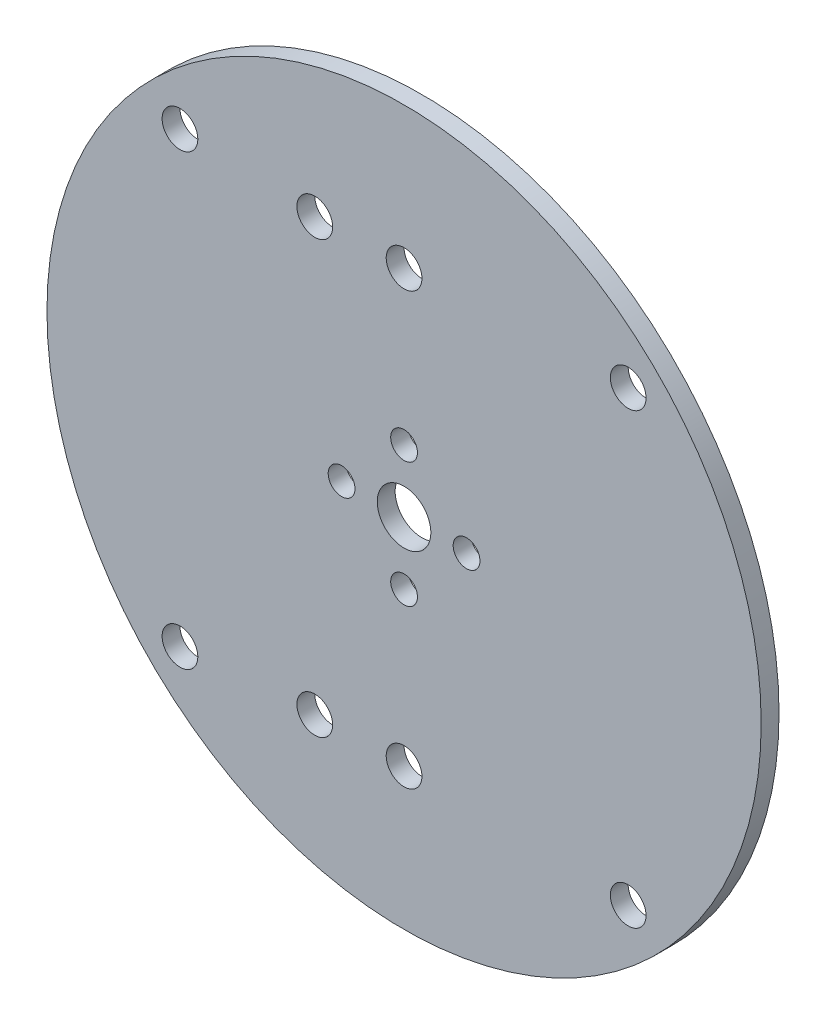
ISO-10303-21;
HEADER;
FILE_DESCRIPTION(('STEP AP214'),'2;1');
FILE_NAME('part.step','',(''),(''),'','','');
FILE_SCHEMA(('AUTOMOTIVE_DESIGN { 1 0 10303 214 1 1 1 1 }'));
ENDSEC;
DATA;
#1=APPLICATION_CONTEXT('core data for automotive mechanical design processes');
#2=APPLICATION_PROTOCOL_DEFINITION('international standard','automotive_design',2000,#1);
#3=PRODUCT_CONTEXT('',#1,'mechanical');
#4=PRODUCT('Part','Part','',(#3));
#5=PRODUCT_RELATED_PRODUCT_CATEGORY('part','',(#4));
#6=PRODUCT_DEFINITION_FORMATION('','',#4);
#7=PRODUCT_DEFINITION_CONTEXT('part definition',#1,'design');
#8=PRODUCT_DEFINITION('design','',#6,#7);
#9=PRODUCT_DEFINITION_SHAPE('','',#8);
#10=(LENGTH_UNIT() NAMED_UNIT(*) SI_UNIT(.MILLI.,.METRE.));
#11=(NAMED_UNIT(*) PLANE_ANGLE_UNIT() SI_UNIT($,.RADIAN.));
#12=(NAMED_UNIT(*) SI_UNIT($,.STERADIAN.) SOLID_ANGLE_UNIT());
#13=UNCERTAINTY_MEASURE_WITH_UNIT(LENGTH_MEASURE(1.E-05),#10,'distance_accuracy_value','');
#14=(GEOMETRIC_REPRESENTATION_CONTEXT(3) GLOBAL_UNCERTAINTY_ASSIGNED_CONTEXT((#13)) GLOBAL_UNIT_ASSIGNED_CONTEXT((#10,
#11,#12)) REPRESENTATION_CONTEXT('',''));
#15=CARTESIAN_POINT('',(0.,0.,0.));
#16=DIRECTION('',(0.,0.,1.));
#17=DIRECTION('',(1.,0.,0.));
#18=AXIS2_PLACEMENT_3D('',#15,#16,#17);
#19=CARTESIAN_POINT('',(64.7426065483763,40.5692941488828,2.));
#20=DIRECTION('',(0.,0.,1.));
#21=DIRECTION('',(1.,0.,0.));
#22=AXIS2_PLACEMENT_3D('',#19,#20,#21);
#23=PLANE('',#22);
#24=CARTESIAN_POINT('',(64.7426065483763,40.5692941488828,2.));
#25=DIRECTION('',(0.,0.,1.));
#26=DIRECTION('',(1.,0.,0.));
#27=AXIS2_PLACEMENT_3D('',#24,#25,#26);
#28=CIRCLE('',#27,3.00000000000001);
#29=CARTESIAN_POINT('',(67.7426065483763,40.5692941488828,2.));
#30=VERTEX_POINT('',#29);
#31=EDGE_CURVE('E109',#30,#30,#28,.T.);
#32=ORIENTED_EDGE('',*,*,#31,.F.);
#33=EDGE_LOOP('',(#32));
#34=FACE_BOUND('',#33,.T.);
#35=CARTESIAN_POINT('',(71.7426065483763,40.5692941488828,2.));
#36=DIRECTION('',(0.,0.,1.));
#37=DIRECTION('',(1.,0.,0.));
#38=AXIS2_PLACEMENT_3D('',#35,#36,#37);
#39=CIRCLE('',#38,1.49999999999994);
#40=CARTESIAN_POINT('',(73.2426065483762,40.5692941488828,2.));
#41=VERTEX_POINT('',#40);
#42=EDGE_CURVE('E97',#41,#41,#39,.T.);
#43=ORIENTED_EDGE('',*,*,#42,.F.);
#44=EDGE_LOOP('',(#43));
#45=FACE_BOUND('',#44,.T.);
#46=CARTESIAN_POINT('',(57.7426065483763,40.5692941488828,2.));
#47=DIRECTION('',(0.,0.,1.));
#48=DIRECTION('',(1.,0.,0.));
#49=AXIS2_PLACEMENT_3D('',#46,#47,#48);
#50=CIRCLE('',#49,1.49999999999995);
#51=CARTESIAN_POINT('',(59.2426065483762,40.5692941488828,2.));
#52=VERTEX_POINT('',#51);
#53=EDGE_CURVE('E85',#52,#52,#50,.T.);
#54=ORIENTED_EDGE('',*,*,#53,.F.);
#55=EDGE_LOOP('',(#54));
#56=FACE_BOUND('',#55,.T.);
#57=CARTESIAN_POINT('',(89.8448972804962,15.4670034167628,2.));
#58=DIRECTION('',(0.,0.,1.));
#59=DIRECTION('',(1.,0.,0.));
#60=AXIS2_PLACEMENT_3D('',#57,#58,#59);
#61=CIRCLE('',#60,2.);
#62=CARTESIAN_POINT('',(91.8448972804962,15.4670034167628,2.));
#63=VERTEX_POINT('',#62);
#64=EDGE_CURVE('E73',#63,#63,#61,.T.);
#65=ORIENTED_EDGE('',*,*,#64,.F.);
#66=EDGE_LOOP('',(#65));
#67=FACE_BOUND('',#66,.T.);
#68=CARTESIAN_POINT('',(54.7426065483771,64.7142941488828,2.));
#69=DIRECTION('',(0.,0.,1.));
#70=DIRECTION('',(1.,0.,0.));
#71=AXIS2_PLACEMENT_3D('',#68,#69,#70);
#72=CIRCLE('',#71,2.);
#73=CARTESIAN_POINT('',(56.7426065483772,64.7142941488828,2.));
#74=VERTEX_POINT('',#73);
#75=EDGE_CURVE('E61',#74,#74,#72,.T.);
#76=ORIENTED_EDGE('',*,*,#75,.F.);
#77=EDGE_LOOP('',(#76));
#78=FACE_BOUND('',#77,.T.);
#79=CARTESIAN_POINT('',(39.6403158162562,15.4670034167628,2.));
#80=DIRECTION('',(0.,0.,1.));
#81=DIRECTION('',(1.,0.,0.));
#82=AXIS2_PLACEMENT_3D('',#79,#80,#81);
#83=CIRCLE('',#82,2.);
#84=CARTESIAN_POINT('',(41.6403158162562,15.4670034167628,2.));
#85=VERTEX_POINT('',#84);
#86=EDGE_CURVE('E49',#85,#85,#83,.T.);
#87=ORIENTED_EDGE('',*,*,#86,.F.);
#88=EDGE_LOOP('',(#87));
#89=FACE_BOUND('',#88,.T.);
#90=CARTESIAN_POINT('',(64.7426065483763,40.5692941488828,2.));
#91=DIRECTION('',(0.,0.,1.));
#92=DIRECTION('',(1.,0.,0.));
#93=AXIS2_PLACEMENT_3D('',#90,#91,#92);
#94=CIRCLE('',#93,40.);
#95=CARTESIAN_POINT('',(104.742606548376,40.5692941488828,2.));
#96=VERTEX_POINT('',#95);
#97=EDGE_CURVE('E10',#96,#96,#94,.T.);
#98=ORIENTED_EDGE('',*,*,#97,.T.);
#99=EDGE_LOOP('',(#98));
#100=FACE_BOUND('',#99,.T.);
#101=CARTESIAN_POINT('',(89.8448972804962,65.6715848810028,2.));
#102=DIRECTION('',(0.,0.,1.));
#103=DIRECTION('',(1.,0.,0.));
#104=AXIS2_PLACEMENT_3D('',#101,#102,#103);
#105=CIRCLE('',#104,2.);
#106=CARTESIAN_POINT('',(91.8448972804962,65.6715848810028,2.));
#107=VERTEX_POINT('',#106);
#108=EDGE_CURVE('E44',#107,#107,#105,.T.);
#109=ORIENTED_EDGE('',*,*,#108,.F.);
#110=EDGE_LOOP('',(#109));
#111=FACE_BOUND('',#110,.T.);
#112=CARTESIAN_POINT('',(39.6403158162562,65.6715848810028,2.));
#113=DIRECTION('',(0.,0.,1.));
#114=DIRECTION('',(1.,0.,0.));
#115=AXIS2_PLACEMENT_3D('',#112,#113,#114);
#116=CIRCLE('',#115,2.);
#117=CARTESIAN_POINT('',(41.6403158162562,65.6715848810028,2.));
#118=VERTEX_POINT('',#117);
#119=EDGE_CURVE('E55',#118,#118,#116,.T.);
#120=ORIENTED_EDGE('',*,*,#119,.F.);
#121=EDGE_LOOP('',(#120));
#122=FACE_BOUND('',#121,.T.);
#123=CARTESIAN_POINT('',(64.7426065483763,64.7142941488828,2.));
#124=DIRECTION('',(0.,0.,1.));
#125=DIRECTION('',(1.,0.,0.));
#126=AXIS2_PLACEMENT_3D('',#123,#124,#125);
#127=CIRCLE('',#126,2.);
#128=CARTESIAN_POINT('',(66.7426065483763,64.7142941488828,2.));
#129=VERTEX_POINT('',#128);
#130=EDGE_CURVE('E67',#129,#129,#127,.T.);
#131=ORIENTED_EDGE('',*,*,#130,.F.);
#132=EDGE_LOOP('',(#131));
#133=FACE_BOUND('',#132,.T.);
#134=CARTESIAN_POINT('',(64.7426065483763,16.4142941488828,2.));
#135=DIRECTION('',(0.,0.,1.));
#136=DIRECTION('',(1.,0.,0.));
#137=AXIS2_PLACEMENT_3D('',#134,#135,#136);
#138=CIRCLE('',#137,2.);
#139=CARTESIAN_POINT('',(66.7426065483763,16.4142941488828,2.));
#140=VERTEX_POINT('',#139);
#141=EDGE_CURVE('E79',#140,#140,#138,.T.);
#142=ORIENTED_EDGE('',*,*,#141,.F.);
#143=EDGE_LOOP('',(#142));
#144=FACE_BOUND('',#143,.T.);
#145=CARTESIAN_POINT('',(64.7426065483763,33.5692941488828,2.));
#146=DIRECTION('',(0.,0.,1.));
#147=DIRECTION('',(1.,0.,0.));
#148=AXIS2_PLACEMENT_3D('',#145,#146,#147);
#149=CIRCLE('',#148,1.49999999999994);
#150=CARTESIAN_POINT('',(66.2426065483762,33.5692941488828,2.));
#151=VERTEX_POINT('',#150);
#152=EDGE_CURVE('E91',#151,#151,#149,.T.);
#153=ORIENTED_EDGE('',*,*,#152,.F.);
#154=EDGE_LOOP('',(#153));
#155=FACE_BOUND('',#154,.T.);
#156=CARTESIAN_POINT('',(64.7426065483763,47.5692941488828,2.));
#157=DIRECTION('',(0.,0.,1.));
#158=DIRECTION('',(1.,0.,0.));
#159=AXIS2_PLACEMENT_3D('',#156,#157,#158);
#160=CIRCLE('',#159,1.49999999999994);
#161=CARTESIAN_POINT('',(66.2426065483762,47.5692941488828,2.));
#162=VERTEX_POINT('',#161);
#163=EDGE_CURVE('E103',#162,#162,#160,.T.);
#164=ORIENTED_EDGE('',*,*,#163,.F.);
#165=EDGE_LOOP('',(#164));
#166=FACE_BOUND('',#165,.T.);
#167=CARTESIAN_POINT('',(54.7426065483771,16.4142941488828,2.));
#168=DIRECTION('',(0.,0.,1.));
#169=DIRECTION('',(1.,0.,0.));
#170=AXIS2_PLACEMENT_3D('',#167,#168,#169);
#171=CIRCLE('',#170,2.);
#172=CARTESIAN_POINT('',(56.7426065483772,16.4142941488828,2.));
#173=VERTEX_POINT('',#172);
#174=EDGE_CURVE('E115',#173,#173,#171,.T.);
#175=ORIENTED_EDGE('',*,*,#174,.F.);
#176=EDGE_LOOP('',(#175));
#177=FACE_BOUND('',#176,.T.);
#178=ADVANCED_FACE('F33',(#34,#45,#56,#67,#78,#89,#100,#111,#122,#133,#144,#155,#166,#177),#23,.T.);
#179=CARTESIAN_POINT('',(64.7426065483763,40.5692941488828,0.));
#180=DIRECTION('',(0.,0.,1.));
#181=DIRECTION('',(1.,0.,0.));
#182=AXIS2_PLACEMENT_3D('',#179,#180,#181);
#183=PLANE('',#182);
#184=CARTESIAN_POINT('',(64.7426065483763,40.5692941488828,0.));
#185=DIRECTION('',(0.,0.,1.));
#186=DIRECTION('',(1.,0.,0.));
#187=AXIS2_PLACEMENT_3D('',#184,#185,#186);
#188=CIRCLE('',#187,3.00000000000001);
#189=CARTESIAN_POINT('',(67.7426065483763,40.5692941488828,0.));
#190=VERTEX_POINT('',#189);
#191=EDGE_CURVE('E112',#190,#190,#188,.T.);
#192=ORIENTED_EDGE('',*,*,#191,.T.);
#193=EDGE_LOOP('',(#192));
#194=FACE_BOUND('',#193,.T.);
#195=CARTESIAN_POINT('',(71.7426065483763,40.5692941488828,0.));
#196=DIRECTION('',(0.,0.,1.));
#197=DIRECTION('',(1.,0.,0.));
#198=AXIS2_PLACEMENT_3D('',#195,#196,#197);
#199=CIRCLE('',#198,1.49999999999994);
#200=CARTESIAN_POINT('',(73.2426065483762,40.5692941488828,0.));
#201=VERTEX_POINT('',#200);
#202=EDGE_CURVE('E100',#201,#201,#199,.T.);
#203=ORIENTED_EDGE('',*,*,#202,.T.);
#204=EDGE_LOOP('',(#203));
#205=FACE_BOUND('',#204,.T.);
#206=CARTESIAN_POINT('',(57.7426065483763,40.5692941488828,0.));
#207=DIRECTION('',(0.,0.,1.));
#208=DIRECTION('',(1.,0.,0.));
#209=AXIS2_PLACEMENT_3D('',#206,#207,#208);
#210=CIRCLE('',#209,1.49999999999995);
#211=CARTESIAN_POINT('',(59.2426065483762,40.5692941488828,0.));
#212=VERTEX_POINT('',#211);
#213=EDGE_CURVE('E88',#212,#212,#210,.T.);
#214=ORIENTED_EDGE('',*,*,#213,.T.);
#215=EDGE_LOOP('',(#214));
#216=FACE_BOUND('',#215,.T.);
#217=CARTESIAN_POINT('',(89.8448972804962,15.4670034167628,0.));
#218=DIRECTION('',(0.,0.,1.));
#219=DIRECTION('',(1.,0.,0.));
#220=AXIS2_PLACEMENT_3D('',#217,#218,#219);
#221=CIRCLE('',#220,2.);
#222=CARTESIAN_POINT('',(91.8448972804962,15.4670034167628,0.));
#223=VERTEX_POINT('',#222);
#224=EDGE_CURVE('E76',#223,#223,#221,.T.);
#225=ORIENTED_EDGE('',*,*,#224,.T.);
#226=EDGE_LOOP('',(#225));
#227=FACE_BOUND('',#226,.T.);
#228=CARTESIAN_POINT('',(54.7426065483771,64.7142941488828,0.));
#229=DIRECTION('',(0.,0.,1.));
#230=DIRECTION('',(1.,0.,0.));
#231=AXIS2_PLACEMENT_3D('',#228,#229,#230);
#232=CIRCLE('',#231,2.);
#233=CARTESIAN_POINT('',(56.7426065483772,64.7142941488828,0.));
#234=VERTEX_POINT('',#233);
#235=EDGE_CURVE('E64',#234,#234,#232,.T.);
#236=ORIENTED_EDGE('',*,*,#235,.T.);
#237=EDGE_LOOP('',(#236));
#238=FACE_BOUND('',#237,.T.);
#239=CARTESIAN_POINT('',(39.6403158162562,15.4670034167628,0.));
#240=DIRECTION('',(0.,0.,1.));
#241=DIRECTION('',(1.,0.,0.));
#242=AXIS2_PLACEMENT_3D('',#239,#240,#241);
#243=CIRCLE('',#242,2.);
#244=CARTESIAN_POINT('',(41.6403158162562,15.4670034167628,0.));
#245=VERTEX_POINT('',#244);
#246=EDGE_CURVE('E52',#245,#245,#243,.T.);
#247=ORIENTED_EDGE('',*,*,#246,.T.);
#248=EDGE_LOOP('',(#247));
#249=FACE_BOUND('',#248,.T.);
#250=CARTESIAN_POINT('',(64.7426065483763,40.5692941488828,0.));
#251=DIRECTION('',(0.,0.,1.));
#252=DIRECTION('',(1.,0.,0.));
#253=AXIS2_PLACEMENT_3D('',#250,#251,#252);
#254=CIRCLE('',#253,40.);
#255=CARTESIAN_POINT('',(104.742606548376,40.5692941488828,0.));
#256=VERTEX_POINT('',#255);
#257=EDGE_CURVE('E37',#256,#256,#254,.T.);
#258=ORIENTED_EDGE('',*,*,#257,.F.);
#259=EDGE_LOOP('',(#258));
#260=FACE_BOUND('',#259,.T.);
#261=CARTESIAN_POINT('',(89.8448972804962,65.6715848810028,0.));
#262=DIRECTION('',(0.,0.,1.));
#263=DIRECTION('',(1.,0.,0.));
#264=AXIS2_PLACEMENT_3D('',#261,#262,#263);
#265=CIRCLE('',#264,2.);
#266=CARTESIAN_POINT('',(91.8448972804962,65.6715848810028,0.));
#267=VERTEX_POINT('',#266);
#268=EDGE_CURVE('E46',#267,#267,#265,.T.);
#269=ORIENTED_EDGE('',*,*,#268,.T.);
#270=EDGE_LOOP('',(#269));
#271=FACE_BOUND('',#270,.T.);
#272=CARTESIAN_POINT('',(39.6403158162562,65.6715848810028,0.));
#273=DIRECTION('',(0.,0.,1.));
#274=DIRECTION('',(1.,0.,0.));
#275=AXIS2_PLACEMENT_3D('',#272,#273,#274);
#276=CIRCLE('',#275,2.);
#277=CARTESIAN_POINT('',(41.6403158162562,65.6715848810028,0.));
#278=VERTEX_POINT('',#277);
#279=EDGE_CURVE('E58',#278,#278,#276,.T.);
#280=ORIENTED_EDGE('',*,*,#279,.T.);
#281=EDGE_LOOP('',(#280));
#282=FACE_BOUND('',#281,.T.);
#283=CARTESIAN_POINT('',(64.7426065483763,64.7142941488828,0.));
#284=DIRECTION('',(0.,0.,1.));
#285=DIRECTION('',(1.,0.,0.));
#286=AXIS2_PLACEMENT_3D('',#283,#284,#285);
#287=CIRCLE('',#286,2.);
#288=CARTESIAN_POINT('',(66.7426065483763,64.7142941488828,0.));
#289=VERTEX_POINT('',#288);
#290=EDGE_CURVE('E70',#289,#289,#287,.T.);
#291=ORIENTED_EDGE('',*,*,#290,.T.);
#292=EDGE_LOOP('',(#291));
#293=FACE_BOUND('',#292,.T.);
#294=CARTESIAN_POINT('',(64.7426065483763,16.4142941488828,0.));
#295=DIRECTION('',(0.,0.,1.));
#296=DIRECTION('',(1.,0.,0.));
#297=AXIS2_PLACEMENT_3D('',#294,#295,#296);
#298=CIRCLE('',#297,2.);
#299=CARTESIAN_POINT('',(66.7426065483763,16.4142941488828,0.));
#300=VERTEX_POINT('',#299);
#301=EDGE_CURVE('E82',#300,#300,#298,.T.);
#302=ORIENTED_EDGE('',*,*,#301,.T.);
#303=EDGE_LOOP('',(#302));
#304=FACE_BOUND('',#303,.T.);
#305=CARTESIAN_POINT('',(64.7426065483763,33.5692941488828,0.));
#306=DIRECTION('',(0.,0.,1.));
#307=DIRECTION('',(1.,0.,0.));
#308=AXIS2_PLACEMENT_3D('',#305,#306,#307);
#309=CIRCLE('',#308,1.49999999999994);
#310=CARTESIAN_POINT('',(66.2426065483762,33.5692941488828,0.));
#311=VERTEX_POINT('',#310);
#312=EDGE_CURVE('E94',#311,#311,#309,.T.);
#313=ORIENTED_EDGE('',*,*,#312,.T.);
#314=EDGE_LOOP('',(#313));
#315=FACE_BOUND('',#314,.T.);
#316=CARTESIAN_POINT('',(64.7426065483763,47.5692941488828,0.));
#317=DIRECTION('',(0.,0.,1.));
#318=DIRECTION('',(1.,0.,0.));
#319=AXIS2_PLACEMENT_3D('',#316,#317,#318);
#320=CIRCLE('',#319,1.49999999999994);
#321=CARTESIAN_POINT('',(66.2426065483762,47.5692941488828,0.));
#322=VERTEX_POINT('',#321);
#323=EDGE_CURVE('E106',#322,#322,#320,.T.);
#324=ORIENTED_EDGE('',*,*,#323,.T.);
#325=EDGE_LOOP('',(#324));
#326=FACE_BOUND('',#325,.T.);
#327=CARTESIAN_POINT('',(54.7426065483771,16.4142941488828,0.));
#328=DIRECTION('',(0.,0.,1.));
#329=DIRECTION('',(1.,0.,0.));
#330=AXIS2_PLACEMENT_3D('',#327,#328,#329);
#331=CIRCLE('',#330,2.);
#332=CARTESIAN_POINT('',(56.7426065483772,16.4142941488828,0.));
#333=VERTEX_POINT('',#332);
#334=EDGE_CURVE('E118',#333,#333,#331,.T.);
#335=ORIENTED_EDGE('',*,*,#334,.T.);
#336=EDGE_LOOP('',(#335));
#337=FACE_BOUND('',#336,.T.);
#338=ADVANCED_FACE('F128',(#194,#205,#216,#227,#238,#249,#260,#271,#282,#293,#304,#315,#326,
#337),#183,.F.);
#339=CARTESIAN_POINT('',(64.7426065483763,40.5692941488828,2.));
#340=DIRECTION('',(0.,0.,-1.));
#341=DIRECTION('',(-1.,0.,0.));
#342=AXIS2_PLACEMENT_3D('',#339,#340,#341);
#343=CYLINDRICAL_SURFACE('',#342,40.);
#344=ORIENTED_EDGE('',*,*,#97,.F.);
#345=EDGE_LOOP('',(#344));
#346=FACE_BOUND('',#345,.T.);
#347=ORIENTED_EDGE('',*,*,#257,.T.);
#348=EDGE_LOOP('',(#347));
#349=FACE_BOUND('',#348,.T.);
#350=ADVANCED_FACE('F35',(#346,#349),#343,.T.);
#351=CARTESIAN_POINT('',(89.8448972804962,65.6715848810028,2.));
#352=DIRECTION('',(0.,0.,-1.));
#353=DIRECTION('',(-1.,0.,0.));
#354=AXIS2_PLACEMENT_3D('',#351,#352,#353);
#355=CYLINDRICAL_SURFACE('',#354,2.);
#356=ORIENTED_EDGE('',*,*,#108,.T.);
#357=EDGE_LOOP('',(#356));
#358=FACE_BOUND('',#357,.T.);
#359=ORIENTED_EDGE('',*,*,#268,.F.);
#360=EDGE_LOOP('',(#359));
#361=FACE_BOUND('',#360,.T.);
#362=ADVANCED_FACE('F138',(#358,#361),#355,.F.);
#363=CARTESIAN_POINT('',(39.6403158162562,15.4670034167628,2.));
#364=DIRECTION('',(0.,0.,-1.));
#365=DIRECTION('',(-1.,0.,0.));
#366=AXIS2_PLACEMENT_3D('',#363,#364,#365);
#367=CYLINDRICAL_SURFACE('',#366,2.);
#368=ORIENTED_EDGE('',*,*,#86,.T.);
#369=EDGE_LOOP('',(#368));
#370=FACE_BOUND('',#369,.T.);
#371=ORIENTED_EDGE('',*,*,#246,.F.);
#372=EDGE_LOOP('',(#371));
#373=FACE_BOUND('',#372,.T.);
#374=ADVANCED_FACE('F141',(#370,#373),#367,.F.);
#375=CARTESIAN_POINT('',(39.6403158162562,65.6715848810028,2.));
#376=DIRECTION('',(0.,0.,-1.));
#377=DIRECTION('',(-1.,0.,0.));
#378=AXIS2_PLACEMENT_3D('',#375,#376,#377);
#379=CYLINDRICAL_SURFACE('',#378,2.);
#380=ORIENTED_EDGE('',*,*,#119,.T.);
#381=EDGE_LOOP('',(#380));
#382=FACE_BOUND('',#381,.T.);
#383=ORIENTED_EDGE('',*,*,#279,.F.);
#384=EDGE_LOOP('',(#383));
#385=FACE_BOUND('',#384,.T.);
#386=ADVANCED_FACE('F145',(#382,#385),#379,.F.);
#387=CARTESIAN_POINT('',(54.7426065483771,64.7142941488828,2.));
#388=DIRECTION('',(0.,0.,-1.));
#389=DIRECTION('',(-1.,0.,0.));
#390=AXIS2_PLACEMENT_3D('',#387,#388,#389);
#391=CYLINDRICAL_SURFACE('',#390,2.);
#392=ORIENTED_EDGE('',*,*,#75,.T.);
#393=EDGE_LOOP('',(#392));
#394=FACE_BOUND('',#393,.T.);
#395=ORIENTED_EDGE('',*,*,#235,.F.);
#396=EDGE_LOOP('',(#395));
#397=FACE_BOUND('',#396,.T.);
#398=ADVANCED_FACE('F149',(#394,#397),#391,.F.);
#399=CARTESIAN_POINT('',(64.7426065483763,64.7142941488828,2.));
#400=DIRECTION('',(0.,0.,-1.));
#401=DIRECTION('',(-1.,0.,0.));
#402=AXIS2_PLACEMENT_3D('',#399,#400,#401);
#403=CYLINDRICAL_SURFACE('',#402,2.);
#404=ORIENTED_EDGE('',*,*,#130,.T.);
#405=EDGE_LOOP('',(#404));
#406=FACE_BOUND('',#405,.T.);
#407=ORIENTED_EDGE('',*,*,#290,.F.);
#408=EDGE_LOOP('',(#407));
#409=FACE_BOUND('',#408,.T.);
#410=ADVANCED_FACE('F153',(#406,#409),#403,.F.);
#411=CARTESIAN_POINT('',(89.8448972804962,15.4670034167628,2.));
#412=DIRECTION('',(0.,0.,-1.));
#413=DIRECTION('',(-1.,0.,0.));
#414=AXIS2_PLACEMENT_3D('',#411,#412,#413);
#415=CYLINDRICAL_SURFACE('',#414,2.);
#416=ORIENTED_EDGE('',*,*,#64,.T.);
#417=EDGE_LOOP('',(#416));
#418=FACE_BOUND('',#417,.T.);
#419=ORIENTED_EDGE('',*,*,#224,.F.);
#420=EDGE_LOOP('',(#419));
#421=FACE_BOUND('',#420,.T.);
#422=ADVANCED_FACE('F157',(#418,#421),#415,.F.);
#423=CARTESIAN_POINT('',(64.7426065483763,16.4142941488828,2.));
#424=DIRECTION('',(0.,0.,-1.));
#425=DIRECTION('',(-1.,0.,0.));
#426=AXIS2_PLACEMENT_3D('',#423,#424,#425);
#427=CYLINDRICAL_SURFACE('',#426,2.);
#428=ORIENTED_EDGE('',*,*,#141,.T.);
#429=EDGE_LOOP('',(#428));
#430=FACE_BOUND('',#429,.T.);
#431=ORIENTED_EDGE('',*,*,#301,.F.);
#432=EDGE_LOOP('',(#431));
#433=FACE_BOUND('',#432,.T.);
#434=ADVANCED_FACE('F161',(#430,#433),#427,.F.);
#435=CARTESIAN_POINT('',(57.7426065483763,40.5692941488828,2.));
#436=DIRECTION('',(0.,0.,-1.));
#437=DIRECTION('',(-1.,0.,0.));
#438=AXIS2_PLACEMENT_3D('',#435,#436,#437);
#439=CYLINDRICAL_SURFACE('',#438,1.49999999999995);
#440=ORIENTED_EDGE('',*,*,#53,.T.);
#441=EDGE_LOOP('',(#440));
#442=FACE_BOUND('',#441,.T.);
#443=ORIENTED_EDGE('',*,*,#213,.F.);
#444=EDGE_LOOP('',(#443));
#445=FACE_BOUND('',#444,.T.);
#446=ADVANCED_FACE('F165',(#442,#445),#439,.F.);
#447=CARTESIAN_POINT('',(64.7426065483763,33.5692941488828,2.));
#448=DIRECTION('',(0.,0.,-1.));
#449=DIRECTION('',(-1.,0.,0.));
#450=AXIS2_PLACEMENT_3D('',#447,#448,#449);
#451=CYLINDRICAL_SURFACE('',#450,1.49999999999994);
#452=ORIENTED_EDGE('',*,*,#152,.T.);
#453=EDGE_LOOP('',(#452));
#454=FACE_BOUND('',#453,.T.);
#455=ORIENTED_EDGE('',*,*,#312,.F.);
#456=EDGE_LOOP('',(#455));
#457=FACE_BOUND('',#456,.T.);
#458=ADVANCED_FACE('F169',(#454,#457),#451,.F.);
#459=CARTESIAN_POINT('',(71.7426065483763,40.5692941488828,2.));
#460=DIRECTION('',(0.,0.,-1.));
#461=DIRECTION('',(-1.,0.,0.));
#462=AXIS2_PLACEMENT_3D('',#459,#460,#461);
#463=CYLINDRICAL_SURFACE('',#462,1.49999999999994);
#464=ORIENTED_EDGE('',*,*,#42,.T.);
#465=EDGE_LOOP('',(#464));
#466=FACE_BOUND('',#465,.T.);
#467=ORIENTED_EDGE('',*,*,#202,.F.);
#468=EDGE_LOOP('',(#467));
#469=FACE_BOUND('',#468,.T.);
#470=ADVANCED_FACE('F173',(#466,#469),#463,.F.);
#471=CARTESIAN_POINT('',(64.7426065483763,47.5692941488828,2.));
#472=DIRECTION('',(0.,0.,-1.));
#473=DIRECTION('',(-1.,0.,0.));
#474=AXIS2_PLACEMENT_3D('',#471,#472,#473);
#475=CYLINDRICAL_SURFACE('',#474,1.49999999999994);
#476=ORIENTED_EDGE('',*,*,#163,.T.);
#477=EDGE_LOOP('',(#476));
#478=FACE_BOUND('',#477,.T.);
#479=ORIENTED_EDGE('',*,*,#323,.F.);
#480=EDGE_LOOP('',(#479));
#481=FACE_BOUND('',#480,.T.);
#482=ADVANCED_FACE('F177',(#478,#481),#475,.F.);
#483=CARTESIAN_POINT('',(64.7426065483763,40.5692941488828,2.));
#484=DIRECTION('',(0.,0.,-1.));
#485=DIRECTION('',(-1.,0.,0.));
#486=AXIS2_PLACEMENT_3D('',#483,#484,#485);
#487=CYLINDRICAL_SURFACE('',#486,3.00000000000001);
#488=ORIENTED_EDGE('',*,*,#31,.T.);
#489=EDGE_LOOP('',(#488));
#490=FACE_BOUND('',#489,.T.);
#491=ORIENTED_EDGE('',*,*,#191,.F.);
#492=EDGE_LOOP('',(#491));
#493=FACE_BOUND('',#492,.T.);
#494=ADVANCED_FACE('F181',(#490,#493),#487,.F.);
#495=CARTESIAN_POINT('',(54.7426065483771,16.4142941488828,2.));
#496=DIRECTION('',(0.,0.,-1.));
#497=DIRECTION('',(-1.,0.,0.));
#498=AXIS2_PLACEMENT_3D('',#495,#496,#497);
#499=CYLINDRICAL_SURFACE('',#498,2.);
#500=ORIENTED_EDGE('',*,*,#174,.T.);
#501=EDGE_LOOP('',(#500));
#502=FACE_BOUND('',#501,.T.);
#503=ORIENTED_EDGE('',*,*,#334,.F.);
#504=EDGE_LOOP('',(#503));
#505=FACE_BOUND('',#504,.T.);
#506=ADVANCED_FACE('F124',(#502,#505),#499,.F.);
#507=CLOSED_SHELL('',(#178,#338,#350,#362,#374,#386,#398,#410,#422,#434,#446,#458,#470,#482,
#494,#506));
#508=MANIFOLD_SOLID_BREP('B2',#507);
#509=ADVANCED_BREP_SHAPE_REPRESENTATION('',(#18,#508),#14);
#510=SHAPE_DEFINITION_REPRESENTATION(#9,#509);
ENDSEC;
END-ISO-10303-21;
